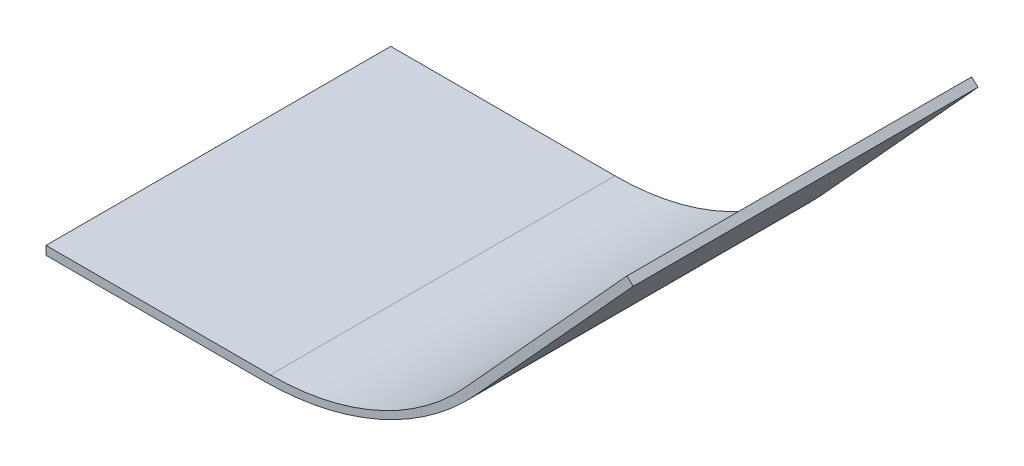
ISO-10303-21;
HEADER;
FILE_DESCRIPTION(('STEP AP214'),'2;1');
FILE_NAME('part.step','',(''),(''),'','','');
FILE_SCHEMA(('AUTOMOTIVE_DESIGN { 1 0 10303 214 1 1 1 1 }'));
ENDSEC;
DATA;
#1=APPLICATION_CONTEXT('core data for automotive mechanical design processes');
#2=APPLICATION_PROTOCOL_DEFINITION('international standard','automotive_design',2000,#1);
#3=PRODUCT_CONTEXT('',#1,'mechanical');
#4=PRODUCT('Part','Part','',(#3));
#5=PRODUCT_RELATED_PRODUCT_CATEGORY('part','',(#4));
#6=PRODUCT_DEFINITION_FORMATION('','',#4);
#7=PRODUCT_DEFINITION_CONTEXT('part definition',#1,'design');
#8=PRODUCT_DEFINITION('design','',#6,#7);
#9=PRODUCT_DEFINITION_SHAPE('','',#8);
#10=(LENGTH_UNIT() NAMED_UNIT(*) SI_UNIT(.MILLI.,.METRE.));
#11=(NAMED_UNIT(*) PLANE_ANGLE_UNIT() SI_UNIT($,.RADIAN.));
#12=(NAMED_UNIT(*) SI_UNIT($,.STERADIAN.) SOLID_ANGLE_UNIT());
#13=UNCERTAINTY_MEASURE_WITH_UNIT(LENGTH_MEASURE(1.E-05),#10,'distance_accuracy_value','');
#14=(GEOMETRIC_REPRESENTATION_CONTEXT(3) GLOBAL_UNCERTAINTY_ASSIGNED_CONTEXT((#13)) GLOBAL_UNIT_ASSIGNED_CONTEXT((#10,
#11,#12)) REPRESENTATION_CONTEXT('',''));
#15=CARTESIAN_POINT('',(0.,0.,0.));
#16=DIRECTION('',(0.,0.,1.));
#17=DIRECTION('',(1.,0.,0.));
#18=AXIS2_PLACEMENT_3D('',#15,#16,#17);
#19=CARTESIAN_POINT('',(-10.,0.25,-20.));
#20=DIRECTION('',(0.,1.,0.));
#21=DIRECTION('',(-1.,0.,0.));
#22=AXIS2_PLACEMENT_3D('',#19,#20,#21);
#23=PLANE('',#22);
#24=DIRECTION('',(-1.,0.,0.));
#25=VECTOR('',#24,1.);
#26=CARTESIAN_POINT('',(-10.,0.25,0.));
#27=LINE('',#26,#25);
#28=CARTESIAN_POINT('',(3.0143599966246,0.25,0.));
#29=VERTEX_POINT('',#28);
#30=CARTESIAN_POINT('',(-10.,0.25,0.));
#31=VERTEX_POINT('',#30);
#32=EDGE_CURVE('E136',#29,#31,#27,.T.);
#33=ORIENTED_EDGE('',*,*,#32,.F.);
#34=DIRECTION('',(0.,0.,1.));
#35=VECTOR('',#34,1.);
#36=CARTESIAN_POINT('',(3.0143599966246,0.25,-20.));
#37=LINE('',#36,#35);
#38=CARTESIAN_POINT('',(3.0143599966246,0.25,-20.));
#39=VERTEX_POINT('',#38);
#40=EDGE_CURVE('E11',#39,#29,#37,.T.);
#41=ORIENTED_EDGE('',*,*,#40,.F.);
#42=DIRECTION('',(-1.,0.,0.));
#43=VECTOR('',#42,1.);
#44=CARTESIAN_POINT('',(-10.,0.25,-20.));
#45=LINE('',#44,#43);
#46=CARTESIAN_POINT('',(-10.,0.25,-20.));
#47=VERTEX_POINT('',#46);
#48=EDGE_CURVE('E156',#39,#47,#45,.T.);
#49=ORIENTED_EDGE('',*,*,#48,.T.);
#50=DIRECTION('',(0.,0.,1.));
#51=VECTOR('',#50,1.);
#52=CARTESIAN_POINT('',(-10.,0.25,-20.));
#53=LINE('',#52,#51);
#54=EDGE_CURVE('E42',#47,#31,#53,.T.);
#55=ORIENTED_EDGE('',*,*,#54,.T.);
#56=EDGE_LOOP('',(#33,#41,#49,#55));
#57=FACE_BOUND('',#56,.T.);
#58=ADVANCED_FACE('F39',(#57),#23,.T.);
#59=CARTESIAN_POINT('',(3.0143599966246,15.4841310882844,-20.));
#60=DIRECTION('',(0.,0.,1.));
#61=DIRECTION('',(1.,0.,0.));
#62=AXIS2_PLACEMENT_3D('',#59,#60,#61);
#63=CYLINDRICAL_SURFACE('',#62,15.2341310882844);
#64=CARTESIAN_POINT('',(3.0143599966246,15.4841310882844,0.));
#65=DIRECTION('',(0.,0.,-1.));
#66=DIRECTION('',(1.,0.,0.));
#67=AXIS2_PLACEMENT_3D('',#64,#65,#66);
#68=CIRCLE('',#67,15.2341310882844);
#69=CARTESIAN_POINT('',(14.2726262080336,5.22108125268099,0.));
#70=VERTEX_POINT('',#69);
#71=EDGE_CURVE('E154',#70,#29,#68,.T.);
#72=ORIENTED_EDGE('',*,*,#71,.F.);
#73=DIRECTION('',(0.,0.,1.));
#74=VECTOR('',#73,1.);
#75=CARTESIAN_POINT('',(14.2726262080336,5.22108125268099,-20.));
#76=LINE('',#75,#74);
#77=CARTESIAN_POINT('',(14.2726262080336,5.22108125268099,-20.));
#78=VERTEX_POINT('',#77);
#79=EDGE_CURVE('E48',#78,#70,#76,.T.);
#80=ORIENTED_EDGE('',*,*,#79,.F.);
#81=CARTESIAN_POINT('',(3.0143599966246,15.4841310882844,-20.));
#82=DIRECTION('',(0.,0.,-1.));
#83=DIRECTION('',(1.,0.,0.));
#84=AXIS2_PLACEMENT_3D('',#81,#82,#83);
#85=CIRCLE('',#84,15.2341310882844);
#86=EDGE_CURVE('E126',#78,#39,#85,.T.);
#87=ORIENTED_EDGE('',*,*,#86,.T.);
#88=ORIENTED_EDGE('',*,*,#40,.T.);
#89=EDGE_LOOP('',(#72,#80,#87,#88));
#90=FACE_BOUND('',#89,.T.);
#91=ADVANCED_FACE('F168',(#90),#63,.F.);
#92=CARTESIAN_POINT('',(23.704256858038,15.5673048768783,-20.));
#93=DIRECTION('',(-0.739015973156949,0.673687903571741,0.));
#94=DIRECTION('',(-0.673687903571741,-0.739015973156949,0.));
#95=AXIS2_PLACEMENT_3D('',#92,#93,#94);
#96=PLANE('',#95);
#97=DIRECTION('',(-0.673687903571741,-0.739015973156949,0.));
#98=VECTOR('',#97,1.);
#99=CARTESIAN_POINT('',(23.704256858038,15.5673048768783,0.));
#100=LINE('',#99,#98);
#101=CARTESIAN_POINT('',(23.704256858038,15.5673048768783,0.));
#102=VERTEX_POINT('',#101);
#103=EDGE_CURVE('E113',#102,#70,#100,.T.);
#104=ORIENTED_EDGE('',*,*,#103,.F.);
#105=DIRECTION('',(0.,0.,1.));
#106=VECTOR('',#105,1.);
#107=CARTESIAN_POINT('',(23.704256858038,15.5673048768783,-20.));
#108=LINE('',#107,#106);
#109=CARTESIAN_POINT('',(23.704256858038,15.5673048768783,-20.));
#110=VERTEX_POINT('',#109);
#111=EDGE_CURVE('E108',#110,#102,#108,.T.);
#112=ORIENTED_EDGE('',*,*,#111,.F.);
#113=DIRECTION('',(-0.673687903571741,-0.739015973156949,0.));
#114=VECTOR('',#113,1.);
#115=CARTESIAN_POINT('',(23.704256858038,15.5673048768783,-20.));
#116=LINE('',#115,#114);
#117=EDGE_CURVE('E111',#110,#78,#116,.T.);
#118=ORIENTED_EDGE('',*,*,#117,.T.);
#119=ORIENTED_EDGE('',*,*,#79,.T.);
#120=EDGE_LOOP('',(#104,#112,#118,#119));
#121=FACE_BOUND('',#120,.T.);
#122=ADVANCED_FACE('F110',(#121),#96,.T.);
#123=CARTESIAN_POINT('',(23.704256858038,15.5673048768783,-20.));
#124=DIRECTION('',(0.673687903571741,0.739015973156949,0.));
#125=DIRECTION('',(-0.739015973156949,0.673687903571741,0.));
#126=AXIS2_PLACEMENT_3D('',#123,#124,#125);
#127=PLANE('',#126);
#128=DIRECTION('',(-0.739015973156949,0.673687903571741,0.));
#129=VECTOR('',#128,1.);
#130=CARTESIAN_POINT('',(23.704256858038,15.5673048768783,0.));
#131=LINE('',#130,#129);
#132=CARTESIAN_POINT('',(24.0737648446165,15.2304609250924,0.));
#133=VERTEX_POINT('',#132);
#134=EDGE_CURVE('E151',#133,#102,#131,.T.);
#135=ORIENTED_EDGE('',*,*,#134,.F.);
#136=DIRECTION('',(0.,0.,1.));
#137=VECTOR('',#136,1.);
#138=CARTESIAN_POINT('',(24.0737648446165,15.2304609250924,-20.));
#139=LINE('',#138,#137);
#140=CARTESIAN_POINT('',(24.0737648446165,15.2304609250924,-20.));
#141=VERTEX_POINT('',#140);
#142=EDGE_CURVE('E118',#141,#133,#139,.T.);
#143=ORIENTED_EDGE('',*,*,#142,.F.);
#144=DIRECTION('',(-0.739015973156949,0.673687903571741,0.));
#145=VECTOR('',#144,1.);
#146=CARTESIAN_POINT('',(23.704256858038,15.5673048768783,-20.));
#147=LINE('',#146,#145);
#148=EDGE_CURVE('E124',#141,#110,#147,.T.);
#149=ORIENTED_EDGE('',*,*,#148,.T.);
#150=ORIENTED_EDGE('',*,*,#111,.T.);
#151=EDGE_LOOP('',(#135,#143,#149,#150));
#152=FACE_BOUND('',#151,.T.);
#153=ADVANCED_FACE('F128',(#152),#127,.T.);
#154=CARTESIAN_POINT('',(24.0737648446165,15.2304609250924,-20.));
#155=DIRECTION('',(0.739015973156949,-0.673687903571741,0.));
#156=DIRECTION('',(0.673687903571741,0.739015973156949,0.));
#157=AXIS2_PLACEMENT_3D('',#154,#155,#156);
#158=PLANE('',#157);
#159=DIRECTION('',(0.673687903571741,0.739015973156949,0.));
#160=VECTOR('',#159,1.);
#161=CARTESIAN_POINT('',(24.0737648446165,15.2304609250924,0.));
#162=LINE('',#161,#160);
#163=CARTESIAN_POINT('',(14.9492015706257,5.22108125268099,0.));
#164=VERTEX_POINT('',#163);
#165=EDGE_CURVE('E148',#164,#133,#162,.T.);
#166=ORIENTED_EDGE('',*,*,#165,.F.);
#167=DIRECTION('',(0.,0.,1.));
#168=VECTOR('',#167,1.);
#169=CARTESIAN_POINT('',(14.9492015706257,5.22108125268099,-20.));
#170=LINE('',#169,#168);
#171=CARTESIAN_POINT('',(14.9492015706257,5.22108125268099,-20.));
#172=VERTEX_POINT('',#171);
#173=EDGE_CURVE('E160',#172,#164,#170,.T.);
#174=ORIENTED_EDGE('',*,*,#173,.F.);
#175=DIRECTION('',(0.673687903571741,0.739015973156949,0.));
#176=VECTOR('',#175,1.);
#177=CARTESIAN_POINT('',(24.0737648446165,15.2304609250924,-20.));
#178=LINE('',#177,#176);
#179=EDGE_CURVE('E129',#172,#141,#178,.T.);
#180=ORIENTED_EDGE('',*,*,#179,.T.);
#181=ORIENTED_EDGE('',*,*,#142,.T.);
#182=EDGE_LOOP('',(#166,#174,#180,#181));
#183=FACE_BOUND('',#182,.T.);
#184=ADVANCED_FACE('F181',(#183),#158,.T.);
#185=CARTESIAN_POINT('',(2.55855935899167,16.51640649417,-20.));
#186=DIRECTION('',(0.,0.,1.));
#187=DIRECTION('',(1.,0.,0.));
#188=AXIS2_PLACEMENT_3D('',#185,#186,#187);
#189=CYLINDRICAL_SURFACE('',#188,16.76640649417);
#190=CARTESIAN_POINT('',(2.55855935899167,16.51640649417,0.));
#191=DIRECTION('',(0.,0.,1.));
#192=DIRECTION('',(1.,0.,0.));
#193=AXIS2_PLACEMENT_3D('',#190,#191,#192);
#194=CIRCLE('',#193,16.76640649417);
#195=CARTESIAN_POINT('',(2.55855935899167,-0.249999999999997,0.));
#196=VERTEX_POINT('',#195);
#197=EDGE_CURVE('E145',#196,#164,#194,.T.);
#198=ORIENTED_EDGE('',*,*,#197,.F.);
#199=DIRECTION('',(0.,0.,1.));
#200=VECTOR('',#199,1.);
#201=CARTESIAN_POINT('',(2.55855935899167,-0.249999999999997,-20.));
#202=LINE('',#201,#200);
#203=CARTESIAN_POINT('',(2.55855935899167,-0.249999999999997,-20.));
#204=VERTEX_POINT('',#203);
#205=EDGE_CURVE('E162',#204,#196,#202,.T.);
#206=ORIENTED_EDGE('',*,*,#205,.F.);
#207=CARTESIAN_POINT('',(2.55855935899167,16.51640649417,-20.));
#208=DIRECTION('',(0.,0.,1.));
#209=DIRECTION('',(1.,0.,0.));
#210=AXIS2_PLACEMENT_3D('',#207,#208,#209);
#211=CIRCLE('',#210,16.76640649417);
#212=EDGE_CURVE('E131',#204,#172,#211,.T.);
#213=ORIENTED_EDGE('',*,*,#212,.T.);
#214=ORIENTED_EDGE('',*,*,#173,.T.);
#215=EDGE_LOOP('',(#198,#206,#213,#214));
#216=FACE_BOUND('',#215,.T.);
#217=ADVANCED_FACE('F184',(#216),#189,.T.);
#218=CARTESIAN_POINT('',(-10.,-0.25,-20.));
#219=DIRECTION('',(0.,-1.,0.));
#220=DIRECTION('',(1.,0.,0.));
#221=AXIS2_PLACEMENT_3D('',#218,#219,#220);
#222=PLANE('',#221);
#223=DIRECTION('',(1.,0.,0.));
#224=VECTOR('',#223,1.);
#225=CARTESIAN_POINT('',(-10.,-0.25,0.));
#226=LINE('',#225,#224);
#227=CARTESIAN_POINT('',(-10.,-0.25,0.));
#228=VERTEX_POINT('',#227);
#229=EDGE_CURVE('E142',#228,#196,#226,.T.);
#230=ORIENTED_EDGE('',*,*,#229,.F.);
#231=DIRECTION('',(0.,0.,1.));
#232=VECTOR('',#231,1.);
#233=CARTESIAN_POINT('',(-10.,-0.25,-20.));
#234=LINE('',#233,#232);
#235=CARTESIAN_POINT('',(-10.,-0.25,-20.));
#236=VERTEX_POINT('',#235);
#237=EDGE_CURVE('E163',#236,#228,#234,.T.);
#238=ORIENTED_EDGE('',*,*,#237,.F.);
#239=DIRECTION('',(1.,0.,0.));
#240=VECTOR('',#239,1.);
#241=CARTESIAN_POINT('',(-10.,-0.25,-20.));
#242=LINE('',#241,#240);
#243=EDGE_CURVE('E259',#236,#204,#242,.T.);
#244=ORIENTED_EDGE('',*,*,#243,.T.);
#245=ORIENTED_EDGE('',*,*,#205,.T.);
#246=EDGE_LOOP('',(#230,#238,#244,#245));
#247=FACE_BOUND('',#246,.T.);
#248=ADVANCED_FACE('F188',(#247),#222,.T.);
#249=CARTESIAN_POINT('',(-10.,0.25,-20.));
#250=DIRECTION('',(-1.,0.,0.));
#251=DIRECTION('',(0.,0.,1.));
#252=AXIS2_PLACEMENT_3D('',#249,#250,#251);
#253=PLANE('',#252);
#254=DIRECTION('',(0.,-1.,0.));
#255=VECTOR('',#254,1.);
#256=CARTESIAN_POINT('',(-10.,0.25,0.));
#257=LINE('',#256,#255);
#258=EDGE_CURVE('E139',#31,#228,#257,.T.);
#259=ORIENTED_EDGE('',*,*,#258,.F.);
#260=ORIENTED_EDGE('',*,*,#54,.F.);
#261=DIRECTION('',(0.,-1.,0.));
#262=VECTOR('',#261,1.);
#263=CARTESIAN_POINT('',(-10.,0.25,-20.));
#264=LINE('',#263,#262);
#265=EDGE_CURVE('E260',#47,#236,#264,.T.);
#266=ORIENTED_EDGE('',*,*,#265,.T.);
#267=ORIENTED_EDGE('',*,*,#237,.T.);
#268=EDGE_LOOP('',(#259,#260,#266,#267));
#269=FACE_BOUND('',#268,.T.);
#270=ADVANCED_FACE('F165',(#269),#253,.T.);
#271=CARTESIAN_POINT('',(3.0143599966246,15.4841310882844,-20.));
#272=DIRECTION('',(0.,0.,1.));
#273=DIRECTION('',(1.,0.,0.));
#274=AXIS2_PLACEMENT_3D('',#271,#272,#273);
#275=PLANE('',#274);
#276=ORIENTED_EDGE('',*,*,#48,.F.);
#277=ORIENTED_EDGE('',*,*,#86,.F.);
#278=ORIENTED_EDGE('',*,*,#117,.F.);
#279=ORIENTED_EDGE('',*,*,#148,.F.);
#280=ORIENTED_EDGE('',*,*,#179,.F.);
#281=ORIENTED_EDGE('',*,*,#212,.F.);
#282=ORIENTED_EDGE('',*,*,#243,.F.);
#283=ORIENTED_EDGE('',*,*,#265,.F.);
#284=EDGE_LOOP('',(#276,#277,#278,#279,#280,#281,#282,#283));
#285=FACE_BOUND('',#284,.T.);
#286=ADVANCED_FACE('F122',(#285),#275,.F.);
#287=CARTESIAN_POINT('',(3.0143599966246,15.4841310882844,0.));
#288=DIRECTION('',(0.,0.,1.));
#289=DIRECTION('',(1.,0.,0.));
#290=AXIS2_PLACEMENT_3D('',#287,#288,#289);
#291=PLANE('',#290);
#292=ORIENTED_EDGE('',*,*,#32,.T.);
#293=ORIENTED_EDGE('',*,*,#258,.T.);
#294=ORIENTED_EDGE('',*,*,#229,.T.);
#295=ORIENTED_EDGE('',*,*,#197,.T.);
#296=ORIENTED_EDGE('',*,*,#165,.T.);
#297=ORIENTED_EDGE('',*,*,#134,.T.);
#298=ORIENTED_EDGE('',*,*,#103,.T.);
#299=ORIENTED_EDGE('',*,*,#71,.T.);
#300=EDGE_LOOP('',(#292,#293,#294,#295,#296,#297,#298,#299));
#301=FACE_BOUND('',#300,.T.);
#302=ADVANCED_FACE('F167',(#301),#291,.T.);
#303=CLOSED_SHELL('',(#58,#91,#122,#153,#184,#217,#248,#270,#286,#302));
#304=MANIFOLD_SOLID_BREP('B2',#303);
#305=ADVANCED_BREP_SHAPE_REPRESENTATION('',(#18,#304),#14);
#306=SHAPE_DEFINITION_REPRESENTATION(#9,#305);
ENDSEC;
END-ISO-10303-21;
